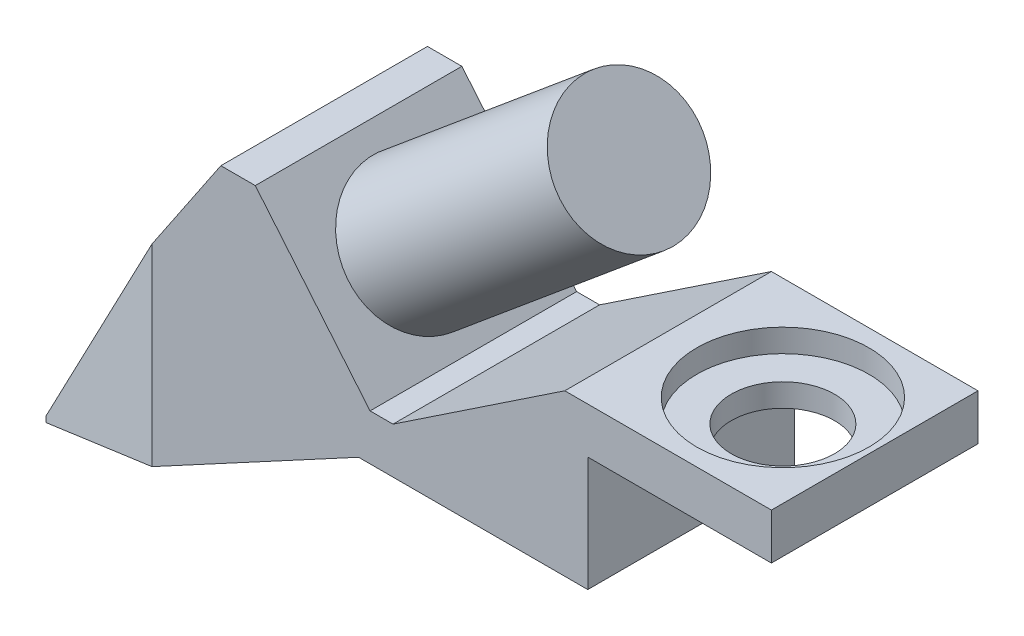
ISO-10303-21;
HEADER;
FILE_DESCRIPTION(('STEP AP214'),'2;1');
FILE_NAME('part.step','',(''),(''),'','','');
FILE_SCHEMA(('AUTOMOTIVE_DESIGN { 1 0 10303 214 1 1 1 1 }'));
ENDSEC;
DATA;
#1=APPLICATION_CONTEXT('core data for automotive mechanical design processes');
#2=APPLICATION_PROTOCOL_DEFINITION('international standard','automotive_design',2000,#1);
#3=PRODUCT_CONTEXT('',#1,'mechanical');
#4=PRODUCT('Part','Part','',(#3));
#5=PRODUCT_RELATED_PRODUCT_CATEGORY('part','',(#4));
#6=PRODUCT_DEFINITION_FORMATION('','',#4);
#7=PRODUCT_DEFINITION_CONTEXT('part definition',#1,'design');
#8=PRODUCT_DEFINITION('design','',#6,#7);
#9=PRODUCT_DEFINITION_SHAPE('','',#8);
#10=(LENGTH_UNIT() NAMED_UNIT(*) SI_UNIT(.MILLI.,.METRE.));
#11=(NAMED_UNIT(*) PLANE_ANGLE_UNIT() SI_UNIT($,.RADIAN.));
#12=(NAMED_UNIT(*) SI_UNIT($,.STERADIAN.) SOLID_ANGLE_UNIT());
#13=UNCERTAINTY_MEASURE_WITH_UNIT(LENGTH_MEASURE(1.E-05),#10,'distance_accuracy_value','');
#14=(GEOMETRIC_REPRESENTATION_CONTEXT(3) GLOBAL_UNCERTAINTY_ASSIGNED_CONTEXT((#13)) GLOBAL_UNIT_ASSIGNED_CONTEXT((#10,
#11,#12)) REPRESENTATION_CONTEXT('',''));
#15=CARTESIAN_POINT('',(0.,0.,0.));
#16=DIRECTION('',(0.,0.,1.));
#17=DIRECTION('',(1.,0.,0.));
#18=AXIS2_PLACEMENT_3D('',#15,#16,#17);
#19=CARTESIAN_POINT('',(31.6,0.,4.5));
#20=DIRECTION('',(0.,1.,0.));
#21=DIRECTION('',(0.,0.,1.));
#22=AXIS2_PLACEMENT_3D('',#19,#20,#21);
#23=CYLINDRICAL_SURFACE('',#22,2.25);
#24=CARTESIAN_POINT('',(31.6,14.5,4.5));
#25=DIRECTION('',(0.,1.,0.));
#26=DIRECTION('',(0.,0.,1.));
#27=AXIS2_PLACEMENT_3D('',#24,#25,#26);
#28=CIRCLE('',#27,2.25);
#29=CARTESIAN_POINT('',(31.6,14.5,6.75));
#30=VERTEX_POINT('',#29);
#31=EDGE_CURVE('E200',#30,#30,#28,.T.);
#32=ORIENTED_EDGE('',*,*,#31,.F.);
#33=EDGE_LOOP('',(#32));
#34=FACE_BOUND('',#33,.T.);
#35=CARTESIAN_POINT('',(31.6,15.5,4.5));
#36=DIRECTION('',(0.,1.,0.));
#37=DIRECTION('',(0.,0.,1.));
#38=AXIS2_PLACEMENT_3D('',#35,#36,#37);
#39=CIRCLE('',#38,2.25);
#40=CARTESIAN_POINT('',(31.6,15.5,6.75));
#41=VERTEX_POINT('',#40);
#42=EDGE_CURVE('E388',#41,#41,#39,.T.);
#43=ORIENTED_EDGE('',*,*,#42,.T.);
#44=EDGE_LOOP('',(#43));
#45=FACE_BOUND('',#44,.T.);
#46=ADVANCED_FACE('F45',(#34,#45),#23,.F.);
#47=CARTESIAN_POINT('',(0.,0.,9.));
#48=DIRECTION('',(1.,0.,0.));
#49=DIRECTION('',(0.,0.,-1.));
#50=AXIS2_PLACEMENT_3D('',#47,#48,#49);
#51=PLANE('',#50);
#52=DIRECTION('',(0.,0.,-1.));
#53=VECTOR('',#52,1.);
#54=CARTESIAN_POINT('',(0.,0.25,9.));
#55=LINE('',#54,#53);
#56=CARTESIAN_POINT('',(0.,0.25,5.));
#57=VERTEX_POINT('',#56);
#58=CARTESIAN_POINT('',(0.,0.250000000000008,4.));
#59=VERTEX_POINT('',#58);
#60=EDGE_CURVE('E162',#57,#59,#55,.T.);
#61=ORIENTED_EDGE('',*,*,#60,.T.);
#62=DIRECTION('',(0.,1.,0.));
#63=VECTOR('',#62,1.);
#64=CARTESIAN_POINT('',(0.,0.,4.));
#65=LINE('',#64,#63);
#66=CARTESIAN_POINT('',(0.,0.,4.));
#67=VERTEX_POINT('',#66);
#68=EDGE_CURVE('E148',#67,#59,#65,.T.);
#69=ORIENTED_EDGE('',*,*,#68,.F.);
#70=DIRECTION('',(0.,0.,-1.));
#71=VECTOR('',#70,1.);
#72=CARTESIAN_POINT('',(0.,0.,9.));
#73=LINE('',#72,#71);
#74=CARTESIAN_POINT('',(0.,0.,5.));
#75=VERTEX_POINT('',#74);
#76=EDGE_CURVE('E160',#75,#67,#73,.T.);
#77=ORIENTED_EDGE('',*,*,#76,.F.);
#78=DIRECTION('',(0.,1.,0.));
#79=VECTOR('',#78,1.);
#80=CARTESIAN_POINT('',(0.,0.,5.));
#81=LINE('',#80,#79);
#82=EDGE_CURVE('E164',#75,#57,#81,.T.);
#83=ORIENTED_EDGE('',*,*,#82,.T.);
#84=EDGE_LOOP('',(#61,#69,#77,#83));
#85=FACE_BOUND('',#84,.T.);
#86=ADVANCED_FACE('F47',(#85),#51,.F.);
#87=CARTESIAN_POINT('',(0.,0.,9.));
#88=DIRECTION('',(-0.474645573053964,0.880177016275859,0.));
#89=DIRECTION('',(-0.880177016275859,-0.474645573053964,0.));
#90=AXIS2_PLACEMENT_3D('',#87,#88,#89);
#91=PLANE('',#90);
#92=ORIENTED_EDGE('',*,*,#76,.T.);
#93=DIRECTION('',(0.814787559864974,0.439383557077732,-0.378237124115283));
#94=VECTOR('',#93,1.);
#95=CARTESIAN_POINT('',(-1.54091451704119,-0.830955865063124,4.715316610295));
#96=LINE('',#95,#94);
#97=CARTESIAN_POINT('',(8.61668522645211,4.64664655121279,0.));
#98=VERTEX_POINT('',#97);
#99=EDGE_CURVE('E145',#67,#98,#96,.T.);
#100=ORIENTED_EDGE('',*,*,#99,.T.);
#101=DIRECTION('',(0.880177016275859,0.474645573053964,0.));
#102=VECTOR('',#101,1.);
#103=CARTESIAN_POINT('',(0.,0.,0.));
#104=LINE('',#103,#102);
#105=CARTESIAN_POINT('',(17.6166852264521,9.5,0.));
#106=VERTEX_POINT('',#105);
#107=EDGE_CURVE('E228',#98,#106,#104,.T.);
#108=ORIENTED_EDGE('',*,*,#107,.T.);
#109=DIRECTION('',(0.,0.,-1.));
#110=VECTOR('',#109,1.);
#111=CARTESIAN_POINT('',(17.6166852264521,9.5,9.));
#112=LINE('',#111,#110);
#113=CARTESIAN_POINT('',(17.6166852264521,9.5,9.));
#114=VERTEX_POINT('',#113);
#115=EDGE_CURVE('E169',#114,#106,#112,.T.);
#116=ORIENTED_EDGE('',*,*,#115,.F.);
#117=DIRECTION('',(0.880177016275859,0.474645573053964,0.));
#118=VECTOR('',#117,1.);
#119=CARTESIAN_POINT('',(0.,0.,9.));
#120=LINE('',#119,#118);
#121=CARTESIAN_POINT('',(8.61668522645211,4.64664655121279,9.));
#122=VERTEX_POINT('',#121);
#123=EDGE_CURVE('E182',#122,#114,#120,.T.);
#124=ORIENTED_EDGE('',*,*,#123,.F.);
#125=DIRECTION('',(0.814787559864974,0.439383557077732,0.378237124115283));
#126=VECTOR('',#125,1.);
#127=CARTESIAN_POINT('',(1.23273161363295,0.664764692050499,5.572253288236));
#128=LINE('',#127,#126);
#129=EDGE_CURVE('E61',#75,#122,#128,.T.);
#130=ORIENTED_EDGE('',*,*,#129,.F.);
#131=EDGE_LOOP('',(#92,#100,#108,#116,#124,#130));
#132=FACE_BOUND('',#131,.T.);
#133=ADVANCED_FACE('F166',(#132),#91,.F.);
#134=CARTESIAN_POINT('',(11.6166852264521,17.5,9.));
#135=DIRECTION('',(0.829451668795888,-0.558578489678681,0.));
#136=DIRECTION('',(0.558578489678681,0.829451668795888,0.));
#137=AXIS2_PLACEMENT_3D('',#134,#135,#136);
#138=PLANE('',#137);
#139=DIRECTION('',(-0.558578489678681,-0.829451668795888,0.));
#140=VECTOR('',#139,1.);
#141=CARTESIAN_POINT('',(11.6166852264521,17.5,0.));
#142=LINE('',#141,#140);
#143=CARTESIAN_POINT('',(11.6166852264521,17.5,0.));
#144=VERTEX_POINT('',#143);
#145=CARTESIAN_POINT('',(8.61668522645212,13.0452008046012,0.));
#146=VERTEX_POINT('',#145);
#147=EDGE_CURVE('E190',#144,#146,#142,.T.);
#148=ORIENTED_EDGE('',*,*,#147,.T.);
#149=DIRECTION('',(-0.540696779594401,-0.802898526230621,0.250999898631335));
#150=VECTOR('',#149,1.);
#151=CARTESIAN_POINT('',(10.2062488472969,15.4055963843261,-0.737900284886843));
#152=LINE('',#151,#150);
#153=EDGE_CURVE('E69',#146,#59,#152,.T.);
#154=ORIENTED_EDGE('',*,*,#153,.T.);
#155=ORIENTED_EDGE('',*,*,#60,.F.);
#156=DIRECTION('',(-0.540696779594401,-0.802898526230621,-0.250999898631335));
#157=VECTOR('',#156,1.);
#158=CARTESIAN_POINT('',(11.4276823791133,17.2193434225823,10.3049088269033));
#159=LINE('',#158,#157);
#160=CARTESIAN_POINT('',(8.61668522645211,13.0452008046012,9.));
#161=VERTEX_POINT('',#160);
#162=EDGE_CURVE('E154',#161,#57,#159,.T.);
#163=ORIENTED_EDGE('',*,*,#162,.F.);
#164=DIRECTION('',(-0.558578489678681,-0.829451668795888,0.));
#165=VECTOR('',#164,1.);
#166=CARTESIAN_POINT('',(11.6166852264521,17.5,9.));
#167=LINE('',#166,#165);
#168=CARTESIAN_POINT('',(11.6166852264521,17.5,9.));
#169=VERTEX_POINT('',#168);
#170=EDGE_CURVE('E185',#169,#161,#167,.T.);
#171=ORIENTED_EDGE('',*,*,#170,.F.);
#172=DIRECTION('',(0.,0.,-1.));
#173=VECTOR('',#172,1.);
#174=CARTESIAN_POINT('',(11.6166852264521,17.5,9.));
#175=LINE('',#174,#173);
#176=EDGE_CURVE('E259',#169,#144,#175,.T.);
#177=ORIENTED_EDGE('',*,*,#176,.T.);
#178=EDGE_LOOP('',(#148,#154,#155,#163,#171,#177));
#179=FACE_BOUND('',#178,.T.);
#180=ADVANCED_FACE('F323',(#179),#138,.F.);
#181=CARTESIAN_POINT('',(0.,0.,9.));
#182=DIRECTION('',(0.,0.,1.));
#183=DIRECTION('',(1.,0.,0.));
#184=AXIS2_PLACEMENT_3D('',#181,#182,#183);
#185=PLANE('',#184);
#186=ORIENTED_EDGE('',*,*,#170,.T.);
#187=DIRECTION('',(0.,-1.,0.));
#188=VECTOR('',#187,1.);
#189=CARTESIAN_POINT('',(8.61668522645211,0.,9.));
#190=LINE('',#189,#188);
#191=EDGE_CURVE('E54',#161,#122,#190,.T.);
#192=ORIENTED_EDGE('',*,*,#191,.T.);
#193=ORIENTED_EDGE('',*,*,#123,.T.);
#194=DIRECTION('',(1.,0.,0.));
#195=VECTOR('',#194,1.);
#196=CARTESIAN_POINT('',(17.6166852264521,9.5,9.));
#197=LINE('',#196,#195);
#198=CARTESIAN_POINT('',(27.6,9.5,9.));
#199=VERTEX_POINT('',#198);
#200=EDGE_CURVE('E189',#114,#199,#197,.T.);
#201=ORIENTED_EDGE('',*,*,#200,.T.);
#202=DIRECTION('',(0.,1.,0.));
#203=VECTOR('',#202,1.);
#204=CARTESIAN_POINT('',(27.6,9.5,9.));
#205=LINE('',#204,#203);
#206=CARTESIAN_POINT('',(27.6,14.5,9.));
#207=VERTEX_POINT('',#206);
#208=EDGE_CURVE('E194',#199,#207,#205,.T.);
#209=ORIENTED_EDGE('',*,*,#208,.T.);
#210=DIRECTION('',(1.,0.,0.));
#211=VECTOR('',#210,1.);
#212=CARTESIAN_POINT('',(27.6,14.5,9.));
#213=LINE('',#212,#211);
#214=CARTESIAN_POINT('',(35.6,14.5,9.));
#215=VERTEX_POINT('',#214);
#216=EDGE_CURVE('E205',#207,#215,#213,.T.);
#217=ORIENTED_EDGE('',*,*,#216,.T.);
#218=DIRECTION('',(0.,1.,0.));
#219=VECTOR('',#218,1.);
#220=CARTESIAN_POINT('',(35.6,14.5,9.));
#221=LINE('',#220,#219);
#222=CARTESIAN_POINT('',(35.6,16.5,9.));
#223=VERTEX_POINT('',#222);
#224=EDGE_CURVE('E208',#215,#223,#221,.T.);
#225=ORIENTED_EDGE('',*,*,#224,.T.);
#226=DIRECTION('',(-1.,0.,0.));
#227=VECTOR('',#226,1.);
#228=CARTESIAN_POINT('',(35.6,16.5,9.));
#229=LINE('',#228,#227);
#230=CARTESIAN_POINT('',(26.6,16.5,9.));
#231=VERTEX_POINT('',#230);
#232=EDGE_CURVE('E211',#223,#231,#229,.T.);
#233=ORIENTED_EDGE('',*,*,#232,.T.);
#234=DIRECTION('',(-0.831479419283098,-0.555555555555556,0.));
#235=VECTOR('',#234,1.);
#236=CARTESIAN_POINT('',(26.6,16.5,9.));
#237=LINE('',#236,#235);
#238=CARTESIAN_POINT('',(19.1166852264521,11.5,9.));
#239=VERTEX_POINT('',#238);
#240=EDGE_CURVE('E214',#231,#239,#237,.T.);
#241=ORIENTED_EDGE('',*,*,#240,.T.);
#242=DIRECTION('',(-1.,0.,0.));
#243=VECTOR('',#242,1.);
#244=CARTESIAN_POINT('',(19.1166852264521,11.5,9.));
#245=LINE('',#244,#243);
#246=CARTESIAN_POINT('',(18.1166852264521,11.5,9.));
#247=VERTEX_POINT('',#246);
#248=EDGE_CURVE('E217',#239,#247,#245,.T.);
#249=ORIENTED_EDGE('',*,*,#248,.T.);
#250=DIRECTION('',(-0.64018439966448,0.768221279597376,0.));
#251=VECTOR('',#250,1.);
#252=CARTESIAN_POINT('',(18.1166852264521,11.5,9.));
#253=LINE('',#252,#251);
#254=CARTESIAN_POINT('',(13.1166852264521,17.5,9.));
#255=VERTEX_POINT('',#254);
#256=EDGE_CURVE('E220',#247,#255,#253,.T.);
#257=ORIENTED_EDGE('',*,*,#256,.T.);
#258=DIRECTION('',(-1.,0.,0.));
#259=VECTOR('',#258,1.);
#260=CARTESIAN_POINT('',(13.1166852264521,17.5,9.));
#261=LINE('',#260,#259);
#262=EDGE_CURVE('E223',#255,#169,#261,.T.);
#263=ORIENTED_EDGE('',*,*,#262,.T.);
#264=EDGE_LOOP('',(#186,#192,#193,#201,#209,#217,#225,#233,#241,#249,#257,#263));
#265=FACE_BOUND('',#264,.T.);
#266=ADVANCED_FACE('F181',(#265),#185,.T.);
#267=CARTESIAN_POINT('',(17.6166852264521,9.5,9.));
#268=DIRECTION('',(0.,1.,0.));
#269=DIRECTION('',(0.,0.,1.));
#270=AXIS2_PLACEMENT_3D('',#267,#268,#269);
#271=PLANE('',#270);
#272=DIRECTION('',(1.,0.,0.));
#273=VECTOR('',#272,1.);
#274=CARTESIAN_POINT('',(17.6166852264521,9.5,0.));
#275=LINE('',#274,#273);
#276=CARTESIAN_POINT('',(27.6,9.5,0.));
#277=VERTEX_POINT('',#276);
#278=EDGE_CURVE('E231',#106,#277,#275,.T.);
#279=ORIENTED_EDGE('',*,*,#278,.T.);
#280=DIRECTION('',(0.,0.,-1.));
#281=VECTOR('',#280,1.);
#282=CARTESIAN_POINT('',(27.6,9.5,9.));
#283=LINE('',#282,#281);
#284=EDGE_CURVE('E175',#199,#277,#283,.T.);
#285=ORIENTED_EDGE('',*,*,#284,.F.);
#286=ORIENTED_EDGE('',*,*,#200,.F.);
#287=ORIENTED_EDGE('',*,*,#115,.T.);
#288=EDGE_LOOP('',(#279,#285,#286,#287));
#289=FACE_BOUND('',#288,.T.);
#290=ADVANCED_FACE('F315',(#289),#271,.F.);
#291=CARTESIAN_POINT('',(27.6,9.5,9.));
#292=DIRECTION('',(-1.,0.,0.));
#293=DIRECTION('',(0.,0.,1.));
#294=AXIS2_PLACEMENT_3D('',#291,#292,#293);
#295=PLANE('',#294);
#296=DIRECTION('',(0.,1.,0.));
#297=VECTOR('',#296,1.);
#298=CARTESIAN_POINT('',(27.6,9.5,0.));
#299=LINE('',#298,#297);
#300=CARTESIAN_POINT('',(27.6,14.5,0.));
#301=VERTEX_POINT('',#300);
#302=EDGE_CURVE('E234',#277,#301,#299,.T.);
#303=ORIENTED_EDGE('',*,*,#302,.T.);
#304=DIRECTION('',(0.,0.,-1.));
#305=VECTOR('',#304,1.);
#306=CARTESIAN_POINT('',(27.6,14.5,9.));
#307=LINE('',#306,#305);
#308=EDGE_CURVE('E287',#207,#301,#307,.T.);
#309=ORIENTED_EDGE('',*,*,#308,.F.);
#310=ORIENTED_EDGE('',*,*,#208,.F.);
#311=ORIENTED_EDGE('',*,*,#284,.T.);
#312=EDGE_LOOP('',(#303,#309,#310,#311));
#313=FACE_BOUND('',#312,.T.);
#314=ADVANCED_FACE('F296',(#313),#295,.F.);
#315=CARTESIAN_POINT('',(27.6,14.5,9.));
#316=DIRECTION('',(0.,1.,0.));
#317=DIRECTION('',(0.,0.,1.));
#318=AXIS2_PLACEMENT_3D('',#315,#316,#317);
#319=PLANE('',#318);
#320=ORIENTED_EDGE('',*,*,#31,.T.);
#321=EDGE_LOOP('',(#320));
#322=FACE_BOUND('',#321,.T.);
#323=DIRECTION('',(1.,0.,0.));
#324=VECTOR('',#323,1.);
#325=CARTESIAN_POINT('',(27.6,14.5,0.));
#326=LINE('',#325,#324);
#327=CARTESIAN_POINT('',(35.6,14.5,0.));
#328=VERTEX_POINT('',#327);
#329=EDGE_CURVE('E237',#301,#328,#326,.T.);
#330=ORIENTED_EDGE('',*,*,#329,.T.);
#331=DIRECTION('',(0.,0.,-1.));
#332=VECTOR('',#331,1.);
#333=CARTESIAN_POINT('',(35.6,14.5,9.));
#334=LINE('',#333,#332);
#335=EDGE_CURVE('E283',#215,#328,#334,.T.);
#336=ORIENTED_EDGE('',*,*,#335,.F.);
#337=ORIENTED_EDGE('',*,*,#216,.F.);
#338=ORIENTED_EDGE('',*,*,#308,.T.);
#339=EDGE_LOOP('',(#330,#336,#337,#338));
#340=FACE_BOUND('',#339,.T.);
#341=ADVANCED_FACE('F307',(#322,#340),#319,.F.);
#342=CARTESIAN_POINT('',(35.6,14.5,9.));
#343=DIRECTION('',(-1.,0.,0.));
#344=DIRECTION('',(0.,0.,1.));
#345=AXIS2_PLACEMENT_3D('',#342,#343,#344);
#346=PLANE('',#345);
#347=DIRECTION('',(0.,1.,0.));
#348=VECTOR('',#347,1.);
#349=CARTESIAN_POINT('',(35.6,14.5,0.));
#350=LINE('',#349,#348);
#351=CARTESIAN_POINT('',(35.6,16.5,0.));
#352=VERTEX_POINT('',#351);
#353=EDGE_CURVE('E240',#328,#352,#350,.T.);
#354=ORIENTED_EDGE('',*,*,#353,.T.);
#355=DIRECTION('',(0.,0.,-1.));
#356=VECTOR('',#355,1.);
#357=CARTESIAN_POINT('',(35.6,16.5,9.));
#358=LINE('',#357,#356);
#359=EDGE_CURVE('E279',#223,#352,#358,.T.);
#360=ORIENTED_EDGE('',*,*,#359,.F.);
#361=ORIENTED_EDGE('',*,*,#224,.F.);
#362=ORIENTED_EDGE('',*,*,#335,.T.);
#363=EDGE_LOOP('',(#354,#360,#361,#362));
#364=FACE_BOUND('',#363,.T.);
#365=ADVANCED_FACE('F311',(#364),#346,.F.);
#366=CARTESIAN_POINT('',(35.6,16.5,9.));
#367=DIRECTION('',(0.,-1.,0.));
#368=DIRECTION('',(0.,0.,-1.));
#369=AXIS2_PLACEMENT_3D('',#366,#367,#368);
#370=PLANE('',#369);
#371=CARTESIAN_POINT('',(31.6,16.5,4.5));
#372=DIRECTION('',(0.,1.,0.));
#373=DIRECTION('',(0.,0.,1.));
#374=AXIS2_PLACEMENT_3D('',#371,#372,#373);
#375=CIRCLE('',#374,3.75000000000001);
#376=CARTESIAN_POINT('',(31.6,16.5,8.25000000000001));
#377=VERTEX_POINT('',#376);
#378=EDGE_CURVE('E384',#377,#377,#375,.T.);
#379=ORIENTED_EDGE('',*,*,#378,.F.);
#380=EDGE_LOOP('',(#379));
#381=FACE_BOUND('',#380,.T.);
#382=DIRECTION('',(-1.,0.,0.));
#383=VECTOR('',#382,1.);
#384=CARTESIAN_POINT('',(35.6,16.5,0.));
#385=LINE('',#384,#383);
#386=CARTESIAN_POINT('',(26.6,16.5,0.));
#387=VERTEX_POINT('',#386);
#388=EDGE_CURVE('E243',#352,#387,#385,.T.);
#389=ORIENTED_EDGE('',*,*,#388,.T.);
#390=DIRECTION('',(0.,0.,-1.));
#391=VECTOR('',#390,1.);
#392=CARTESIAN_POINT('',(26.6,16.5,9.));
#393=LINE('',#392,#391);
#394=EDGE_CURVE('E275',#231,#387,#393,.T.);
#395=ORIENTED_EDGE('',*,*,#394,.F.);
#396=ORIENTED_EDGE('',*,*,#232,.F.);
#397=ORIENTED_EDGE('',*,*,#359,.T.);
#398=EDGE_LOOP('',(#389,#395,#396,#397));
#399=FACE_BOUND('',#398,.T.);
#400=ADVANCED_FACE('F362',(#381,#399),#370,.F.);
#401=CARTESIAN_POINT('',(26.6,16.5,9.));
#402=DIRECTION('',(0.555555555555556,-0.831479419283098,0.));
#403=DIRECTION('',(0.831479419283098,0.555555555555556,0.));
#404=AXIS2_PLACEMENT_3D('',#401,#402,#403);
#405=PLANE('',#404);
#406=DIRECTION('',(-0.831479419283098,-0.555555555555556,0.));
#407=VECTOR('',#406,1.);
#408=CARTESIAN_POINT('',(26.6,16.5,0.));
#409=LINE('',#408,#407);
#410=CARTESIAN_POINT('',(19.1166852264521,11.5,0.));
#411=VERTEX_POINT('',#410);
#412=EDGE_CURVE('E246',#387,#411,#409,.T.);
#413=ORIENTED_EDGE('',*,*,#412,.T.);
#414=DIRECTION('',(0.,0.,-1.));
#415=VECTOR('',#414,1.);
#416=CARTESIAN_POINT('',(19.1166852264521,11.5,9.));
#417=LINE('',#416,#415);
#418=EDGE_CURVE('E271',#239,#411,#417,.T.);
#419=ORIENTED_EDGE('',*,*,#418,.F.);
#420=ORIENTED_EDGE('',*,*,#240,.F.);
#421=ORIENTED_EDGE('',*,*,#394,.T.);
#422=EDGE_LOOP('',(#413,#419,#420,#421));
#423=FACE_BOUND('',#422,.T.);
#424=ADVANCED_FACE('F358',(#423),#405,.F.);
#425=CARTESIAN_POINT('',(19.1166852264521,11.5,9.));
#426=DIRECTION('',(0.,-1.,0.));
#427=DIRECTION('',(0.,0.,-1.));
#428=AXIS2_PLACEMENT_3D('',#425,#426,#427);
#429=PLANE('',#428);
#430=DIRECTION('',(-1.,0.,0.));
#431=VECTOR('',#430,1.);
#432=CARTESIAN_POINT('',(19.1166852264521,11.5,0.));
#433=LINE('',#432,#431);
#434=CARTESIAN_POINT('',(18.1166852264521,11.5,0.));
#435=VERTEX_POINT('',#434);
#436=EDGE_CURVE('E249',#411,#435,#433,.T.);
#437=ORIENTED_EDGE('',*,*,#436,.T.);
#438=DIRECTION('',(0.,0.,-1.));
#439=VECTOR('',#438,1.);
#440=CARTESIAN_POINT('',(18.1166852264521,11.5,9.));
#441=LINE('',#440,#439);
#442=EDGE_CURVE('E267',#247,#435,#441,.T.);
#443=ORIENTED_EDGE('',*,*,#442,.F.);
#444=ORIENTED_EDGE('',*,*,#248,.F.);
#445=ORIENTED_EDGE('',*,*,#418,.T.);
#446=EDGE_LOOP('',(#437,#443,#444,#445));
#447=FACE_BOUND('',#446,.T.);
#448=ADVANCED_FACE('F354',(#447),#429,.F.);
#449=CARTESIAN_POINT('',(18.1166852264521,11.5,9.));
#450=DIRECTION('',(-0.768221279597376,-0.64018439966448,0.));
#451=DIRECTION('',(0.64018439966448,-0.768221279597376,0.));
#452=AXIS2_PLACEMENT_3D('',#449,#450,#451);
#453=PLANE('',#452);
#454=CARTESIAN_POINT('',(15.67742282511,14.4271148816105,4.5));
#455=DIRECTION('',(-0.768221279597376,-0.64018439966448,0.));
#456=DIRECTION('',(0.64018439966448,-0.768221279597376,0.));
#457=AXIS2_PLACEMENT_3D('',#454,#455,#456);
#458=CIRCLE('',#457,3.);
#459=CARTESIAN_POINT('',(17.5979760241035,12.1224510428184,4.5));
#460=VERTEX_POINT('',#459);
#461=EDGE_CURVE('E11',#460,#460,#458,.F.);
#462=ORIENTED_EDGE('',*,*,#461,.F.);
#463=EDGE_LOOP('',(#462));
#464=FACE_BOUND('',#463,.T.);
#465=DIRECTION('',(-0.64018439966448,0.768221279597376,0.));
#466=VECTOR('',#465,1.);
#467=CARTESIAN_POINT('',(18.1166852264521,11.5,0.));
#468=LINE('',#467,#466);
#469=CARTESIAN_POINT('',(13.1166852264521,17.5,0.));
#470=VERTEX_POINT('',#469);
#471=EDGE_CURVE('E252',#435,#470,#468,.T.);
#472=ORIENTED_EDGE('',*,*,#471,.T.);
#473=DIRECTION('',(0.,0.,-1.));
#474=VECTOR('',#473,1.);
#475=CARTESIAN_POINT('',(13.1166852264521,17.5,9.));
#476=LINE('',#475,#474);
#477=EDGE_CURVE('E263',#255,#470,#476,.T.);
#478=ORIENTED_EDGE('',*,*,#477,.F.);
#479=ORIENTED_EDGE('',*,*,#256,.F.);
#480=ORIENTED_EDGE('',*,*,#442,.T.);
#481=EDGE_LOOP('',(#472,#478,#479,#480));
#482=FACE_BOUND('',#481,.T.);
#483=ADVANCED_FACE('F350',(#464,#482),#453,.F.);
#484=CARTESIAN_POINT('',(13.1166852264521,17.5,9.));
#485=DIRECTION('',(0.,-1.,0.));
#486=DIRECTION('',(0.,0.,-1.));
#487=AXIS2_PLACEMENT_3D('',#484,#485,#486);
#488=PLANE('',#487);
#489=DIRECTION('',(-1.,0.,0.));
#490=VECTOR('',#489,1.);
#491=CARTESIAN_POINT('',(13.1166852264521,17.5,0.));
#492=LINE('',#491,#490);
#493=EDGE_CURVE('E197',#470,#144,#492,.T.);
#494=ORIENTED_EDGE('',*,*,#493,.T.);
#495=ORIENTED_EDGE('',*,*,#176,.F.);
#496=ORIENTED_EDGE('',*,*,#262,.F.);
#497=ORIENTED_EDGE('',*,*,#477,.T.);
#498=EDGE_LOOP('',(#494,#495,#496,#497));
#499=FACE_BOUND('',#498,.T.);
#500=ADVANCED_FACE('F344',(#499),#488,.F.);
#501=CARTESIAN_POINT('',(0.,0.,0.));
#502=DIRECTION('',(0.,0.,1.));
#503=DIRECTION('',(1.,0.,0.));
#504=AXIS2_PLACEMENT_3D('',#501,#502,#503);
#505=PLANE('',#504);
#506=ORIENTED_EDGE('',*,*,#107,.F.);
#507=DIRECTION('',(0.,1.,0.));
#508=VECTOR('',#507,1.);
#509=CARTESIAN_POINT('',(8.61668522645211,0.,0.));
#510=LINE('',#509,#508);
#511=EDGE_CURVE('E149',#98,#146,#510,.T.);
#512=ORIENTED_EDGE('',*,*,#511,.T.);
#513=ORIENTED_EDGE('',*,*,#147,.F.);
#514=ORIENTED_EDGE('',*,*,#493,.F.);
#515=ORIENTED_EDGE('',*,*,#471,.F.);
#516=ORIENTED_EDGE('',*,*,#436,.F.);
#517=ORIENTED_EDGE('',*,*,#412,.F.);
#518=ORIENTED_EDGE('',*,*,#388,.F.);
#519=ORIENTED_EDGE('',*,*,#353,.F.);
#520=ORIENTED_EDGE('',*,*,#329,.F.);
#521=ORIENTED_EDGE('',*,*,#302,.F.);
#522=ORIENTED_EDGE('',*,*,#278,.F.);
#523=EDGE_LOOP('',(#506,#512,#513,#514,#515,#516,#517,#518,#519,#520,#521,#522));
#524=FACE_BOUND('',#523,.T.);
#525=ADVANCED_FACE('F302',(#524),#505,.F.);
#526=CARTESIAN_POINT('',(1.52765809252153,0.,3.29083722922508));
#527=DIRECTION('',(0.421059013314916,0.,0.907033244873786));
#528=DIRECTION('',(0.907033244873786,0.,-0.421059013314916));
#529=AXIS2_PLACEMENT_3D('',#526,#527,#528);
#530=PLANE('',#529);
#531=ORIENTED_EDGE('',*,*,#68,.T.);
#532=ORIENTED_EDGE('',*,*,#153,.F.);
#533=ORIENTED_EDGE('',*,*,#511,.F.);
#534=ORIENTED_EDGE('',*,*,#99,.F.);
#535=EDGE_LOOP('',(#531,#532,#533,#534));
#536=FACE_BOUND('',#535,.T.);
#537=ADVANCED_FACE('F147',(#536),#530,.F.);
#538=CARTESIAN_POINT('',(-1.90957261565192,0.,4.11354653653135));
#539=DIRECTION('',(-0.421059013314916,0.,0.907033244873786));
#540=DIRECTION('',(0.907033244873786,0.,0.421059013314916));
#541=AXIS2_PLACEMENT_3D('',#538,#539,#540);
#542=PLANE('',#541);
#543=ORIENTED_EDGE('',*,*,#129,.T.);
#544=ORIENTED_EDGE('',*,*,#191,.F.);
#545=ORIENTED_EDGE('',*,*,#162,.T.);
#546=ORIENTED_EDGE('',*,*,#82,.F.);
#547=EDGE_LOOP('',(#543,#544,#545,#546));
#548=FACE_BOUND('',#547,.T.);
#549=ADVANCED_FACE('F339',(#548),#542,.T.);
#550=CARTESIAN_POINT('',(31.6,15.5,4.5));
#551=DIRECTION('',(0.,1.,0.));
#552=DIRECTION('',(0.,0.,1.));
#553=AXIS2_PLACEMENT_3D('',#550,#551,#552);
#554=CYLINDRICAL_SURFACE('',#553,3.75000000000001);
#555=CARTESIAN_POINT('',(31.6,15.5,4.5));
#556=DIRECTION('',(0.,1.,0.));
#557=DIRECTION('',(0.,0.,1.));
#558=AXIS2_PLACEMENT_3D('',#555,#556,#557);
#559=CIRCLE('',#558,3.75000000000001);
#560=CARTESIAN_POINT('',(31.6,15.5,8.25000000000001));
#561=VERTEX_POINT('',#560);
#562=EDGE_CURVE('E382',#561,#561,#559,.T.);
#563=ORIENTED_EDGE('',*,*,#562,.F.);
#564=EDGE_LOOP('',(#563));
#565=FACE_BOUND('',#564,.T.);
#566=ORIENTED_EDGE('',*,*,#378,.T.);
#567=EDGE_LOOP('',(#566));
#568=FACE_BOUND('',#567,.T.);
#569=ADVANCED_FACE('F335',(#565,#568),#554,.F.);
#570=CARTESIAN_POINT('',(0.,15.5,0.));
#571=DIRECTION('',(0.,1.,0.));
#572=DIRECTION('',(0.,0.,1.));
#573=AXIS2_PLACEMENT_3D('',#570,#571,#572);
#574=PLANE('',#573);
#575=ORIENTED_EDGE('',*,*,#42,.F.);
#576=EDGE_LOOP('',(#575));
#577=FACE_BOUND('',#576,.T.);
#578=ORIENTED_EDGE('',*,*,#562,.T.);
#579=EDGE_LOOP('',(#578));
#580=FACE_BOUND('',#579,.T.);
#581=ADVANCED_FACE('F405',(#577,#580),#574,.T.);
#582=CARTESIAN_POINT('',(24.8960781802786,22.1093276775843,4.5));
#583=DIRECTION('',(-0.768221279597376,-0.64018439966448,0.));
#584=DIRECTION('',(0.64018439966448,-0.768221279597376,0.));
#585=AXIS2_PLACEMENT_3D('',#582,#583,#584);
#586=CYLINDRICAL_SURFACE('',#585,3.);
#587=CARTESIAN_POINT('',(24.8960781802786,22.1093276775843,4.5));
#588=DIRECTION('',(0.768221279597376,0.64018439966448,0.));
#589=DIRECTION('',(-0.64018439966448,0.768221279597376,0.));
#590=AXIS2_PLACEMENT_3D('',#587,#588,#589);
#591=CIRCLE('',#590,3.);
#592=CARTESIAN_POINT('',(22.9755249812851,24.4139915163764,4.5));
#593=VERTEX_POINT('',#592);
#594=EDGE_CURVE('E389',#593,#593,#591,.T.);
#595=ORIENTED_EDGE('',*,*,#594,.F.);
#596=EDGE_LOOP('',(#595));
#597=FACE_BOUND('',#596,.T.);
#598=ORIENTED_EDGE('',*,*,#461,.T.);
#599=EDGE_LOOP('',(#598));
#600=FACE_BOUND('',#599,.T.);
#601=ADVANCED_FACE('F402',(#597,#600),#586,.T.);
#602=CARTESIAN_POINT('',(24.8960781802786,22.1093276775843,4.5));
#603=DIRECTION('',(0.768221279597376,0.64018439966448,0.));
#604=DIRECTION('',(-0.64018439966448,0.768221279597376,0.));
#605=AXIS2_PLACEMENT_3D('',#602,#603,#604);
#606=PLANE('',#605);
#607=ORIENTED_EDGE('',*,*,#594,.T.);
#608=EDGE_LOOP('',(#607));
#609=FACE_BOUND('',#608,.T.);
#610=ADVANCED_FACE('F400',(#609),#606,.T.);
#611=CLOSED_SHELL('',(#46,#86,#133,#180,#266,#290,#314,#341,#365,#400,#424,#448,#483,#500,#525,
#537,#549,#569,#581,#601,#610));
#612=MANIFOLD_SOLID_BREP('B2',#611);
#613=ADVANCED_BREP_SHAPE_REPRESENTATION('',(#18,#612),#14);
#614=SHAPE_DEFINITION_REPRESENTATION(#9,#613);
ENDSEC;
END-ISO-10303-21;
